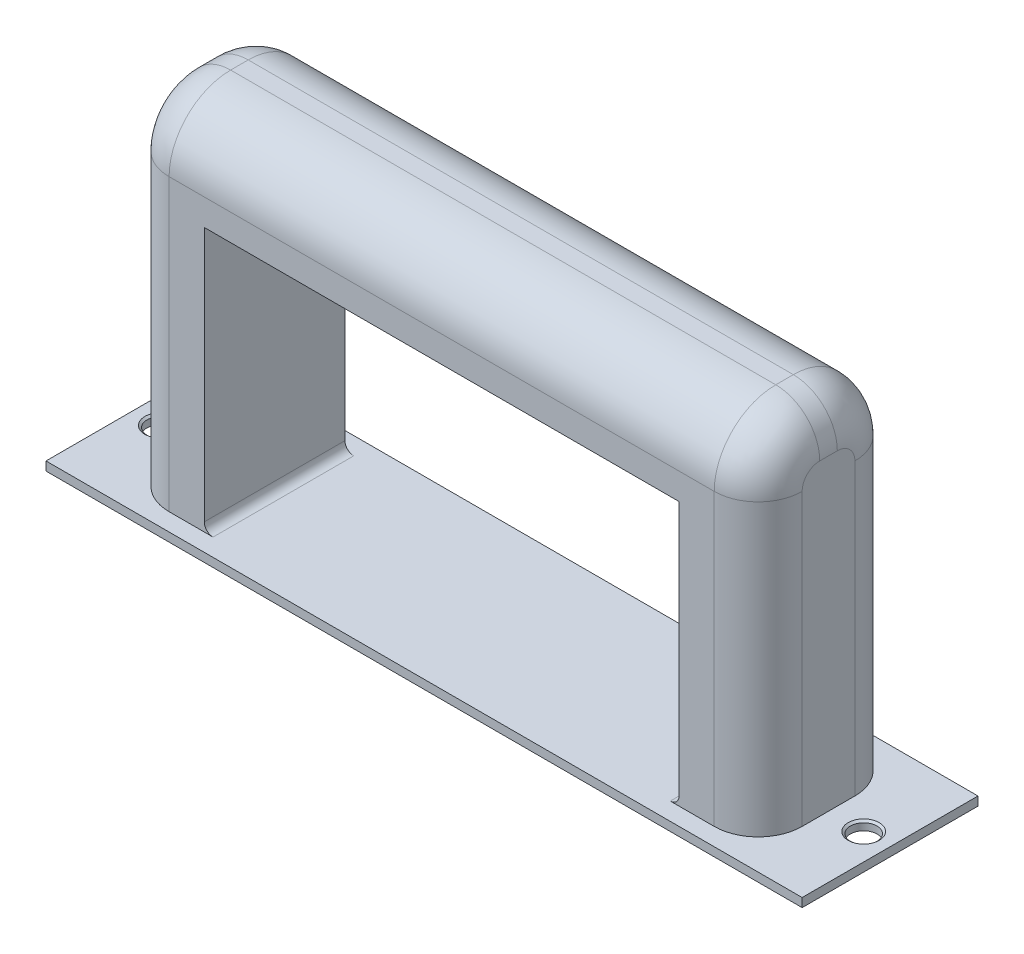
ISO-10303-21;
HEADER;
FILE_DESCRIPTION(('STEP AP214'),'2;1');
FILE_NAME('part.step','',(''),(''),'','','');
FILE_SCHEMA(('AUTOMOTIVE_DESIGN { 1 0 10303 214 1 1 1 1 }'));
ENDSEC;
DATA;
#1=APPLICATION_CONTEXT('core data for automotive mechanical design processes');
#2=APPLICATION_PROTOCOL_DEFINITION('international standard','automotive_design',2000,#1);
#3=PRODUCT_CONTEXT('',#1,'mechanical');
#4=PRODUCT('Part','Part','',(#3));
#5=PRODUCT_RELATED_PRODUCT_CATEGORY('part','',(#4));
#6=PRODUCT_DEFINITION_FORMATION('','',#4);
#7=PRODUCT_DEFINITION_CONTEXT('part definition',#1,'design');
#8=PRODUCT_DEFINITION('design','',#6,#7);
#9=PRODUCT_DEFINITION_SHAPE('','',#8);
#10=(LENGTH_UNIT() NAMED_UNIT(*) SI_UNIT(.MILLI.,.METRE.));
#11=(NAMED_UNIT(*) PLANE_ANGLE_UNIT() SI_UNIT($,.RADIAN.));
#12=(NAMED_UNIT(*) SI_UNIT($,.STERADIAN.) SOLID_ANGLE_UNIT());
#13=UNCERTAINTY_MEASURE_WITH_UNIT(LENGTH_MEASURE(1.E-05),#10,'distance_accuracy_value','');
#14=(GEOMETRIC_REPRESENTATION_CONTEXT(3) GLOBAL_UNCERTAINTY_ASSIGNED_CONTEXT((#13)) GLOBAL_UNIT_ASSIGNED_CONTEXT((#10,
#11,#12)) REPRESENTATION_CONTEXT('',''));
#15=CARTESIAN_POINT('',(0.,0.,0.));
#16=DIRECTION('',(0.,0.,1.));
#17=DIRECTION('',(1.,0.,0.));
#18=AXIS2_PLACEMENT_3D('',#15,#16,#17);
#19=CARTESIAN_POINT('',(0.,2.54,0.));
#20=DIRECTION('',(0.,-1.,0.));
#21=DIRECTION('',(0.,0.,-1.));
#22=AXIS2_PLACEMENT_3D('',#19,#20,#21);
#23=PLANE('',#22);
#24=CARTESIAN_POINT('',(210.82,2.54,-25.4));
#25=DIRECTION('',(0.,1.,0.));
#26=DIRECTION('',(0.,0.,1.));
#27=AXIS2_PLACEMENT_3D('',#24,#25,#26);
#28=CIRCLE('',#27,4.47040000000001);
#29=CARTESIAN_POINT('',(210.82,2.54,-20.9296));
#30=VERTEX_POINT('',#29);
#31=EDGE_CURVE('E734',#30,#30,#28,.T.);
#32=ORIENTED_EDGE('',*,*,#31,.F.);
#33=EDGE_LOOP('',(#32));
#34=FACE_BOUND('',#33,.T.);
#35=DIRECTION('',(-1.,0.,0.));
#36=VECTOR('',#35,1.);
#37=CARTESIAN_POINT('',(0.,2.54,-50.8));
#38=LINE('',#37,#36);
#39=CARTESIAN_POINT('',(218.44,2.54,-50.8));
#40=VERTEX_POINT('',#39);
#41=CARTESIAN_POINT('',(0.,2.54,-50.8));
#42=VERTEX_POINT('',#41);
#43=EDGE_CURVE('E246',#40,#42,#38,.T.);
#44=ORIENTED_EDGE('',*,*,#43,.T.);
#45=DIRECTION('',(0.,0.,1.));
#46=VECTOR('',#45,1.);
#47=CARTESIAN_POINT('',(0.,2.54,0.));
#48=LINE('',#47,#46);
#49=CARTESIAN_POINT('',(0.,2.54,0.));
#50=VERTEX_POINT('',#49);
#51=EDGE_CURVE('E238',#42,#50,#48,.T.);
#52=ORIENTED_EDGE('',*,*,#51,.T.);
#53=DIRECTION('',(1.,0.,0.));
#54=VECTOR('',#53,1.);
#55=CARTESIAN_POINT('',(0.,2.54,0.));
#56=LINE('',#55,#54);
#57=CARTESIAN_POINT('',(218.44,2.54,0.));
#58=VERTEX_POINT('',#57);
#59=EDGE_CURVE('E241',#50,#58,#56,.T.);
#60=ORIENTED_EDGE('',*,*,#59,.T.);
#61=DIRECTION('',(0.,0.,-1.));
#62=VECTOR('',#61,1.);
#63=CARTESIAN_POINT('',(218.44,2.54,0.));
#64=LINE('',#63,#62);
#65=EDGE_CURVE('E244',#58,#40,#64,.T.);
#66=ORIENTED_EDGE('',*,*,#65,.T.);
#67=EDGE_LOOP('',(#44,#52,#60,#66));
#68=FACE_BOUND('',#67,.T.);
#69=DIRECTION('',(-1.,0.,0.));
#70=VECTOR('',#69,1.);
#71=CARTESIAN_POINT('',(17.78,2.54,-45.72));
#72=LINE('',#71,#70);
#73=CARTESIAN_POINT('',(43.18,2.54,-45.72));
#74=VERTEX_POINT('',#73);
#75=CARTESIAN_POINT('',(30.48,2.54,-45.72));
#76=VERTEX_POINT('',#75);
#77=EDGE_CURVE('E235',#74,#76,#72,.T.);
#78=ORIENTED_EDGE('',*,*,#77,.F.);
#79=DIRECTION('',(0.,0.,1.));
#80=VECTOR('',#79,1.);
#81=CARTESIAN_POINT('',(43.18,2.54,0.));
#82=LINE('',#81,#80);
#83=CARTESIAN_POINT('',(43.18,2.54,-5.08));
#84=VERTEX_POINT('',#83);
#85=EDGE_CURVE('E367',#74,#84,#82,.T.);
#86=ORIENTED_EDGE('',*,*,#85,.T.);
#87=DIRECTION('',(1.,0.,0.));
#88=VECTOR('',#87,1.);
#89=CARTESIAN_POINT('',(17.78,2.54,-5.08));
#90=LINE('',#89,#88);
#91=CARTESIAN_POINT('',(30.48,2.54,-5.08));
#92=VERTEX_POINT('',#91);
#93=EDGE_CURVE('E230',#92,#84,#90,.T.);
#94=ORIENTED_EDGE('',*,*,#93,.F.);
#95=CARTESIAN_POINT('',(30.48,2.54,-17.78));
#96=DIRECTION('',(0.,-1.,0.));
#97=DIRECTION('',(0.,0.,-1.));
#98=AXIS2_PLACEMENT_3D('',#95,#96,#97);
#99=CIRCLE('',#98,12.7);
#100=CARTESIAN_POINT('',(17.78,2.54,-17.78));
#101=VERTEX_POINT('',#100);
#102=EDGE_CURVE('E312',#101,#92,#99,.F.);
#103=ORIENTED_EDGE('',*,*,#102,.F.);
#104=DIRECTION('',(0.,0.,1.));
#105=VECTOR('',#104,1.);
#106=CARTESIAN_POINT('',(17.78,2.54,-45.72));
#107=LINE('',#106,#105);
#108=CARTESIAN_POINT('',(17.78,2.54,-33.02));
#109=VERTEX_POINT('',#108);
#110=EDGE_CURVE('E214',#109,#101,#107,.T.);
#111=ORIENTED_EDGE('',*,*,#110,.F.);
#112=CARTESIAN_POINT('',(30.48,2.54,-33.02));
#113=DIRECTION('',(0.,-1.,0.));
#114=DIRECTION('',(0.,0.,-1.));
#115=AXIS2_PLACEMENT_3D('',#112,#113,#114);
#116=CIRCLE('',#115,12.7);
#117=EDGE_CURVE('E324',#76,#109,#116,.F.);
#118=ORIENTED_EDGE('',*,*,#117,.F.);
#119=EDGE_LOOP('',(#78,#86,#94,#103,#111,#118));
#120=FACE_BOUND('',#119,.T.);
#121=DIRECTION('',(0.,0.,1.));
#122=VECTOR('',#121,1.);
#123=CARTESIAN_POINT('',(175.26,2.54,-106.68));
#124=LINE('',#123,#122);
#125=CARTESIAN_POINT('',(175.26,2.54,-5.08));
#126=VERTEX_POINT('',#125);
#127=CARTESIAN_POINT('',(175.26,2.54,-45.72));
#128=VERTEX_POINT('',#127);
#129=EDGE_CURVE('E379',#126,#128,#124,.F.);
#130=ORIENTED_EDGE('',*,*,#129,.T.);
#131=CARTESIAN_POINT('',(187.96,2.54,-45.72));
#132=VERTEX_POINT('',#131);
#133=EDGE_CURVE('E58',#132,#128,#72,.T.);
#134=ORIENTED_EDGE('',*,*,#133,.F.);
#135=CARTESIAN_POINT('',(187.96,2.54,-33.02));
#136=DIRECTION('',(0.,-1.,0.));
#137=DIRECTION('',(0.,0.,-1.));
#138=AXIS2_PLACEMENT_3D('',#135,#136,#137);
#139=CIRCLE('',#138,12.7);
#140=CARTESIAN_POINT('',(200.66,2.54,-33.02));
#141=VERTEX_POINT('',#140);
#142=EDGE_CURVE('E355',#141,#132,#139,.F.);
#143=ORIENTED_EDGE('',*,*,#142,.F.);
#144=DIRECTION('',(0.,0.,-1.));
#145=VECTOR('',#144,1.);
#146=CARTESIAN_POINT('',(200.66,2.54,-45.72));
#147=LINE('',#146,#145);
#148=CARTESIAN_POINT('',(200.66,2.54,-17.78));
#149=VERTEX_POINT('',#148);
#150=EDGE_CURVE('E232',#149,#141,#147,.T.);
#151=ORIENTED_EDGE('',*,*,#150,.F.);
#152=CARTESIAN_POINT('',(187.96,2.54,-17.78));
#153=DIRECTION('',(0.,-1.,0.));
#154=DIRECTION('',(0.,0.,-1.));
#155=AXIS2_PLACEMENT_3D('',#152,#153,#154);
#156=CIRCLE('',#155,12.7);
#157=CARTESIAN_POINT('',(187.96,2.54,-5.08));
#158=VERTEX_POINT('',#157);
#159=EDGE_CURVE('E365',#158,#149,#156,.F.);
#160=ORIENTED_EDGE('',*,*,#159,.F.);
#161=EDGE_CURVE('E66',#126,#158,#90,.T.);
#162=ORIENTED_EDGE('',*,*,#161,.F.);
#163=EDGE_LOOP('',(#130,#134,#143,#151,#160,#162));
#164=FACE_BOUND('',#163,.T.);
#165=CARTESIAN_POINT('',(7.62,2.54,-25.4));
#166=DIRECTION('',(0.,1.,0.));
#167=DIRECTION('',(0.,0.,1.));
#168=AXIS2_PLACEMENT_3D('',#165,#166,#167);
#169=CIRCLE('',#168,4.4704);
#170=CARTESIAN_POINT('',(7.62,2.54,-20.9296));
#171=VERTEX_POINT('',#170);
#172=EDGE_CURVE('E741',#171,#171,#169,.T.);
#173=ORIENTED_EDGE('',*,*,#172,.F.);
#174=EDGE_LOOP('',(#173));
#175=FACE_BOUND('',#174,.T.);
#176=ADVANCED_FACE('F43',(#34,#68,#120,#164,#175),#23,.F.);
#177=CARTESIAN_POINT('',(175.26,5.08,-106.68));
#178=DIRECTION('',(0.,0.,-1.));
#179=DIRECTION('',(-1.,0.,0.));
#180=AXIS2_PLACEMENT_3D('',#177,#178,#179);
#181=CYLINDRICAL_SURFACE('',#180,2.54);
#182=DIRECTION('',(0.,0.,1.));
#183=VECTOR('',#182,1.);
#184=CARTESIAN_POINT('',(177.8,5.08,-106.68));
#185=LINE('',#184,#183);
#186=CARTESIAN_POINT('',(177.8,5.07999999999999,-45.72));
#187=VERTEX_POINT('',#186);
#188=CARTESIAN_POINT('',(177.8,5.08,-5.08));
#189=VERTEX_POINT('',#188);
#190=EDGE_CURVE('E200',#187,#189,#185,.T.);
#191=ORIENTED_EDGE('',*,*,#190,.F.);
#192=CARTESIAN_POINT('',(175.26,5.08,-45.72));
#193=DIRECTION('',(0.,0.,1.));
#194=DIRECTION('',(1.,0.,0.));
#195=AXIS2_PLACEMENT_3D('',#192,#193,#194);
#196=CIRCLE('',#195,2.54);
#197=EDGE_CURVE('E51',#187,#128,#196,.F.);
#198=ORIENTED_EDGE('',*,*,#197,.T.);
#199=ORIENTED_EDGE('',*,*,#129,.F.);
#200=CARTESIAN_POINT('',(175.26,5.08,-5.08));
#201=DIRECTION('',(0.,0.,-1.));
#202=DIRECTION('',(-1.,0.,0.));
#203=AXIS2_PLACEMENT_3D('',#200,#201,#202);
#204=CIRCLE('',#203,2.54);
#205=EDGE_CURVE('E11',#126,#189,#204,.F.);
#206=ORIENTED_EDGE('',*,*,#205,.T.);
#207=EDGE_LOOP('',(#191,#198,#199,#206));
#208=FACE_BOUND('',#207,.T.);
#209=ADVANCED_FACE('F45',(#208),#181,.F.);
#210=CARTESIAN_POINT('',(43.18,5.08,0.));
#211=DIRECTION('',(0.,0.,1.));
#212=DIRECTION('',(1.,0.,0.));
#213=AXIS2_PLACEMENT_3D('',#210,#211,#212);
#214=CYLINDRICAL_SURFACE('',#213,2.54);
#215=ORIENTED_EDGE('',*,*,#85,.F.);
#216=CARTESIAN_POINT('',(43.18,5.08,-45.72));
#217=DIRECTION('',(0.,0.,1.));
#218=DIRECTION('',(1.,0.,0.));
#219=AXIS2_PLACEMENT_3D('',#216,#217,#218);
#220=CIRCLE('',#219,2.54);
#221=CARTESIAN_POINT('',(40.64,5.07999999999999,-45.72));
#222=VERTEX_POINT('',#221);
#223=EDGE_CURVE('E373',#74,#222,#220,.F.);
#224=ORIENTED_EDGE('',*,*,#223,.T.);
#225=DIRECTION('',(0.,0.,1.));
#226=VECTOR('',#225,1.);
#227=CARTESIAN_POINT('',(40.64,5.08,-106.68));
#228=LINE('',#227,#226);
#229=CARTESIAN_POINT('',(40.64,5.08,-5.08));
#230=VERTEX_POINT('',#229);
#231=EDGE_CURVE('E370',#230,#222,#228,.F.);
#232=ORIENTED_EDGE('',*,*,#231,.F.);
#233=CARTESIAN_POINT('',(43.18,5.08,-5.08));
#234=DIRECTION('',(0.,0.,-1.));
#235=DIRECTION('',(-1.,0.,0.));
#236=AXIS2_PLACEMENT_3D('',#233,#234,#235);
#237=CIRCLE('',#236,2.54);
#238=EDGE_CURVE('E375',#230,#84,#237,.F.);
#239=ORIENTED_EDGE('',*,*,#238,.T.);
#240=EDGE_LOOP('',(#215,#224,#232,#239));
#241=FACE_BOUND('',#240,.T.);
#242=ADVANCED_FACE('F417',(#241),#214,.F.);
#243=CARTESIAN_POINT('',(187.96,86.36,-22.86));
#244=DIRECTION('',(-1.,0.,0.));
#245=DIRECTION('',(0.,0.,1.));
#246=AXIS2_PLACEMENT_3D('',#243,#244,#245);
#247=DEGENERATE_TOROIDAL_SURFACE('',#246,5.08,12.7,.T.);
#248=CARTESIAN_POINT('',(187.96,86.36,-17.78));
#249=DIRECTION('',(0.,-1.,0.));
#250=DIRECTION('',(0.,0.,-1.));
#251=AXIS2_PLACEMENT_3D('',#248,#249,#250);
#252=CIRCLE('',#251,12.7);
#253=CARTESIAN_POINT('',(200.66,86.36,-17.78));
#254=VERTEX_POINT('',#253);
#255=CARTESIAN_POINT('',(187.96,86.36,-5.08));
#256=VERTEX_POINT('',#255);
#257=EDGE_CURVE('E363',#254,#256,#252,.T.);
#258=ORIENTED_EDGE('',*,*,#257,.F.);
#259=CARTESIAN_POINT('',(200.66,86.36,-22.86));
#260=DIRECTION('',(-1.,0.,0.));
#261=DIRECTION('',(0.,0.,1.));
#262=AXIS2_PLACEMENT_3D('',#259,#260,#261);
#263=CIRCLE('',#262,5.08);
#264=CARTESIAN_POINT('',(200.66,91.44,-22.86));
#265=VERTEX_POINT('',#264);
#266=EDGE_CURVE('E329',#265,#254,#263,.F.);
#267=ORIENTED_EDGE('',*,*,#266,.F.);
#268=CARTESIAN_POINT('',(187.96,91.44,-22.86));
#269=DIRECTION('',(0.,0.,1.));
#270=DIRECTION('',(1.,0.,0.));
#271=AXIS2_PLACEMENT_3D('',#268,#269,#270);
#272=CIRCLE('',#271,12.7);
#273=CARTESIAN_POINT('',(187.96,104.14,-22.86));
#274=VERTEX_POINT('',#273);
#275=EDGE_CURVE('E361',#265,#274,#272,.T.);
#276=ORIENTED_EDGE('',*,*,#275,.T.);
#277=CARTESIAN_POINT('',(187.96,86.36,-22.86));
#278=DIRECTION('',(-1.,0.,0.));
#279=DIRECTION('',(0.,0.,1.));
#280=AXIS2_PLACEMENT_3D('',#277,#278,#279);
#281=CIRCLE('',#280,17.78);
#282=EDGE_CURVE('E349',#256,#274,#281,.T.);
#283=ORIENTED_EDGE('',*,*,#282,.F.);
#284=EDGE_LOOP('',(#258,#267,#276,#283));
#285=FACE_BOUND('',#284,.T.);
#286=ADVANCED_FACE('F399',(#285),#247,.T.);
#287=CARTESIAN_POINT('',(187.96,91.44,-45.72));
#288=DIRECTION('',(0.,0.,-1.));
#289=DIRECTION('',(-1.,0.,0.));
#290=AXIS2_PLACEMENT_3D('',#287,#288,#289);
#291=CYLINDRICAL_SURFACE('',#290,12.7);
#292=ORIENTED_EDGE('',*,*,#275,.F.);
#293=DIRECTION('',(0.,0.,1.));
#294=VECTOR('',#293,1.);
#295=CARTESIAN_POINT('',(200.66,91.44,-45.72));
#296=LINE('',#295,#294);
#297=CARTESIAN_POINT('',(200.66,91.44,-27.94));
#298=VERTEX_POINT('',#297);
#299=EDGE_CURVE('E332',#298,#265,#296,.T.);
#300=ORIENTED_EDGE('',*,*,#299,.F.);
#301=CARTESIAN_POINT('',(187.96,91.44,-27.94));
#302=DIRECTION('',(0.,0.,1.));
#303=DIRECTION('',(1.,0.,0.));
#304=AXIS2_PLACEMENT_3D('',#301,#302,#303);
#305=CIRCLE('',#304,12.7);
#306=CARTESIAN_POINT('',(187.96,104.14,-27.94));
#307=VERTEX_POINT('',#306);
#308=EDGE_CURVE('E359',#298,#307,#305,.T.);
#309=ORIENTED_EDGE('',*,*,#308,.T.);
#310=DIRECTION('',(0.,0.,1.));
#311=VECTOR('',#310,1.);
#312=CARTESIAN_POINT('',(187.96,104.14,-45.72));
#313=LINE('',#312,#311);
#314=EDGE_CURVE('E346',#274,#307,#313,.F.);
#315=ORIENTED_EDGE('',*,*,#314,.F.);
#316=EDGE_LOOP('',(#292,#300,#309,#315));
#317=FACE_BOUND('',#316,.T.);
#318=ADVANCED_FACE('F439',(#317),#291,.T.);
#319=CARTESIAN_POINT('',(187.96,86.36,-27.94));
#320=DIRECTION('',(-1.,0.,0.));
#321=DIRECTION('',(0.,0.,1.));
#322=AXIS2_PLACEMENT_3D('',#319,#320,#321);
#323=DEGENERATE_TOROIDAL_SURFACE('',#322,5.08,12.7,.T.);
#324=ORIENTED_EDGE('',*,*,#308,.F.);
#325=CARTESIAN_POINT('',(200.66,86.36,-27.94));
#326=DIRECTION('',(-1.,0.,0.));
#327=DIRECTION('',(0.,0.,1.));
#328=AXIS2_PLACEMENT_3D('',#325,#326,#327);
#329=CIRCLE('',#328,5.08);
#330=CARTESIAN_POINT('',(200.66,86.36,-33.02));
#331=VERTEX_POINT('',#330);
#332=EDGE_CURVE('E335',#331,#298,#329,.F.);
#333=ORIENTED_EDGE('',*,*,#332,.F.);
#334=CARTESIAN_POINT('',(187.96,86.36,-33.02));
#335=DIRECTION('',(0.,1.,0.));
#336=DIRECTION('',(0.,0.,1.));
#337=AXIS2_PLACEMENT_3D('',#334,#335,#336);
#338=CIRCLE('',#337,12.7);
#339=CARTESIAN_POINT('',(187.96,86.36,-45.72));
#340=VERTEX_POINT('',#339);
#341=EDGE_CURVE('E357',#331,#340,#338,.T.);
#342=ORIENTED_EDGE('',*,*,#341,.T.);
#343=CARTESIAN_POINT('',(187.96,86.36,-27.94));
#344=DIRECTION('',(-1.,0.,0.));
#345=DIRECTION('',(0.,0.,1.));
#346=AXIS2_PLACEMENT_3D('',#343,#344,#345);
#347=CIRCLE('',#346,17.78);
#348=EDGE_CURVE('E343',#307,#340,#347,.T.);
#349=ORIENTED_EDGE('',*,*,#348,.F.);
#350=EDGE_LOOP('',(#324,#333,#342,#349));
#351=FACE_BOUND('',#350,.T.);
#352=ADVANCED_FACE('F436',(#351),#323,.T.);
#353=CARTESIAN_POINT('',(187.96,104.14,-33.02));
#354=DIRECTION('',(0.,1.,0.));
#355=DIRECTION('',(0.,0.,1.));
#356=AXIS2_PLACEMENT_3D('',#353,#354,#355);
#357=CYLINDRICAL_SURFACE('',#356,12.7);
#358=ORIENTED_EDGE('',*,*,#341,.F.);
#359=DIRECTION('',(0.,1.,0.));
#360=VECTOR('',#359,1.);
#361=CARTESIAN_POINT('',(200.66,104.14,-33.02));
#362=LINE('',#361,#360);
#363=EDGE_CURVE('E338',#141,#331,#362,.T.);
#364=ORIENTED_EDGE('',*,*,#363,.F.);
#365=ORIENTED_EDGE('',*,*,#142,.T.);
#366=DIRECTION('',(0.,1.,0.));
#367=VECTOR('',#366,1.);
#368=CARTESIAN_POINT('',(187.96,104.14,-45.72));
#369=LINE('',#368,#367);
#370=EDGE_CURVE('E341',#340,#132,#369,.F.);
#371=ORIENTED_EDGE('',*,*,#370,.F.);
#372=EDGE_LOOP('',(#358,#364,#365,#371));
#373=FACE_BOUND('',#372,.T.);
#374=ADVANCED_FACE('F387',(#373),#357,.T.);
#375=CARTESIAN_POINT('',(187.96,104.14,-17.78));
#376=DIRECTION('',(0.,-1.,0.));
#377=DIRECTION('',(0.,0.,-1.));
#378=AXIS2_PLACEMENT_3D('',#375,#376,#377);
#379=CYLINDRICAL_SURFACE('',#378,12.7);
#380=DIRECTION('',(0.,-1.,0.));
#381=VECTOR('',#380,1.);
#382=CARTESIAN_POINT('',(200.66,104.14,-17.78));
#383=LINE('',#382,#381);
#384=EDGE_CURVE('E326',#254,#149,#383,.T.);
#385=ORIENTED_EDGE('',*,*,#384,.F.);
#386=ORIENTED_EDGE('',*,*,#257,.T.);
#387=DIRECTION('',(0.,-1.,0.));
#388=VECTOR('',#387,1.);
#389=CARTESIAN_POINT('',(187.96,104.14,-5.08));
#390=LINE('',#389,#388);
#391=EDGE_CURVE('E352',#158,#256,#390,.F.);
#392=ORIENTED_EDGE('',*,*,#391,.F.);
#393=ORIENTED_EDGE('',*,*,#159,.T.);
#394=EDGE_LOOP('',(#385,#386,#392,#393));
#395=FACE_BOUND('',#394,.T.);
#396=ADVANCED_FACE('F394',(#395),#379,.T.);
#397=CARTESIAN_POINT('',(30.48,86.36,-27.94));
#398=DIRECTION('',(1.,0.,0.));
#399=DIRECTION('',(0.,0.,-1.));
#400=AXIS2_PLACEMENT_3D('',#397,#398,#399);
#401=DEGENERATE_TOROIDAL_SURFACE('',#400,5.08,12.7,.T.);
#402=CARTESIAN_POINT('',(30.48,86.36,-33.02));
#403=DIRECTION('',(0.,-1.,0.));
#404=DIRECTION('',(0.,0.,-1.));
#405=AXIS2_PLACEMENT_3D('',#402,#403,#404);
#406=CIRCLE('',#405,12.7);
#407=CARTESIAN_POINT('',(17.78,86.36,-33.02));
#408=VERTEX_POINT('',#407);
#409=CARTESIAN_POINT('',(30.48,86.36,-45.72));
#410=VERTEX_POINT('',#409);
#411=EDGE_CURVE('E322',#408,#410,#406,.T.);
#412=ORIENTED_EDGE('',*,*,#411,.F.);
#413=CARTESIAN_POINT('',(17.78,86.36,-27.94));
#414=DIRECTION('',(1.,0.,0.));
#415=DIRECTION('',(0.,0.,-1.));
#416=AXIS2_PLACEMENT_3D('',#413,#414,#415);
#417=CIRCLE('',#416,5.08);
#418=CARTESIAN_POINT('',(17.78,91.44,-27.94));
#419=VERTEX_POINT('',#418);
#420=EDGE_CURVE('E285',#419,#408,#417,.F.);
#421=ORIENTED_EDGE('',*,*,#420,.F.);
#422=CARTESIAN_POINT('',(30.48,91.44,-27.94));
#423=DIRECTION('',(0.,0.,-1.));
#424=DIRECTION('',(-1.,0.,0.));
#425=AXIS2_PLACEMENT_3D('',#422,#423,#424);
#426=CIRCLE('',#425,12.7);
#427=CARTESIAN_POINT('',(30.48,104.14,-27.94));
#428=VERTEX_POINT('',#427);
#429=EDGE_CURVE('E319',#419,#428,#426,.T.);
#430=ORIENTED_EDGE('',*,*,#429,.T.);
#431=CARTESIAN_POINT('',(30.48,86.36,-27.94));
#432=DIRECTION('',(1.,0.,0.));
#433=DIRECTION('',(0.,0.,-1.));
#434=AXIS2_PLACEMENT_3D('',#431,#432,#433);
#435=CIRCLE('',#434,17.78);
#436=EDGE_CURVE('E306',#410,#428,#435,.T.);
#437=ORIENTED_EDGE('',*,*,#436,.F.);
#438=EDGE_LOOP('',(#412,#421,#430,#437));
#439=FACE_BOUND('',#438,.T.);
#440=ADVANCED_FACE('F428',(#439),#401,.T.);
#441=CARTESIAN_POINT('',(30.48,91.44,-45.72));
#442=DIRECTION('',(0.,0.,1.));
#443=DIRECTION('',(1.,0.,0.));
#444=AXIS2_PLACEMENT_3D('',#441,#442,#443);
#445=CYLINDRICAL_SURFACE('',#444,12.7);
#446=ORIENTED_EDGE('',*,*,#429,.F.);
#447=DIRECTION('',(0.,0.,-1.));
#448=VECTOR('',#447,1.);
#449=CARTESIAN_POINT('',(17.78,91.44,-45.72));
#450=LINE('',#449,#448);
#451=CARTESIAN_POINT('',(17.78,91.44,-22.86));
#452=VERTEX_POINT('',#451);
#453=EDGE_CURVE('E288',#452,#419,#450,.T.);
#454=ORIENTED_EDGE('',*,*,#453,.F.);
#455=CARTESIAN_POINT('',(30.48,91.44,-22.86));
#456=DIRECTION('',(0.,0.,-1.));
#457=DIRECTION('',(-1.,0.,0.));
#458=AXIS2_PLACEMENT_3D('',#455,#456,#457);
#459=CIRCLE('',#458,12.7);
#460=CARTESIAN_POINT('',(30.48,104.14,-22.86));
#461=VERTEX_POINT('',#460);
#462=EDGE_CURVE('E317',#452,#461,#459,.T.);
#463=ORIENTED_EDGE('',*,*,#462,.T.);
#464=DIRECTION('',(0.,0.,-1.));
#465=VECTOR('',#464,1.);
#466=CARTESIAN_POINT('',(30.48,104.14,-45.72));
#467=LINE('',#466,#465);
#468=EDGE_CURVE('E303',#428,#461,#467,.F.);
#469=ORIENTED_EDGE('',*,*,#468,.F.);
#470=EDGE_LOOP('',(#446,#454,#463,#469));
#471=FACE_BOUND('',#470,.T.);
#472=ADVANCED_FACE('F443',(#471),#445,.T.);
#473=CARTESIAN_POINT('',(30.48,86.36,-22.86));
#474=DIRECTION('',(1.,0.,0.));
#475=DIRECTION('',(0.,0.,-1.));
#476=AXIS2_PLACEMENT_3D('',#473,#474,#475);
#477=DEGENERATE_TOROIDAL_SURFACE('',#476,5.08,12.7,.T.);
#478=ORIENTED_EDGE('',*,*,#462,.F.);
#479=CARTESIAN_POINT('',(17.78,86.36,-22.86));
#480=DIRECTION('',(1.,0.,0.));
#481=DIRECTION('',(0.,0.,-1.));
#482=AXIS2_PLACEMENT_3D('',#479,#480,#481);
#483=CIRCLE('',#482,5.08);
#484=CARTESIAN_POINT('',(17.78,86.36,-17.78));
#485=VERTEX_POINT('',#484);
#486=EDGE_CURVE('E291',#485,#452,#483,.F.);
#487=ORIENTED_EDGE('',*,*,#486,.F.);
#488=CARTESIAN_POINT('',(30.48,86.36,-17.78));
#489=DIRECTION('',(0.,1.,0.));
#490=DIRECTION('',(0.,0.,1.));
#491=AXIS2_PLACEMENT_3D('',#488,#489,#490);
#492=CIRCLE('',#491,12.7);
#493=CARTESIAN_POINT('',(30.48,86.36,-5.08));
#494=VERTEX_POINT('',#493);
#495=EDGE_CURVE('E314',#485,#494,#492,.T.);
#496=ORIENTED_EDGE('',*,*,#495,.T.);
#497=CARTESIAN_POINT('',(30.48,86.36,-22.86));
#498=DIRECTION('',(1.,0.,0.));
#499=DIRECTION('',(0.,0.,-1.));
#500=AXIS2_PLACEMENT_3D('',#497,#498,#499);
#501=CIRCLE('',#500,17.78);
#502=EDGE_CURVE('E300',#461,#494,#501,.T.);
#503=ORIENTED_EDGE('',*,*,#502,.F.);
#504=EDGE_LOOP('',(#478,#487,#496,#503));
#505=FACE_BOUND('',#504,.T.);
#506=ADVANCED_FACE('F446',(#505),#477,.T.);
#507=CARTESIAN_POINT('',(30.48,104.14,-17.78));
#508=DIRECTION('',(0.,1.,0.));
#509=DIRECTION('',(0.,0.,1.));
#510=AXIS2_PLACEMENT_3D('',#507,#508,#509);
#511=CYLINDRICAL_SURFACE('',#510,12.7);
#512=ORIENTED_EDGE('',*,*,#495,.F.);
#513=DIRECTION('',(0.,1.,0.));
#514=VECTOR('',#513,1.);
#515=CARTESIAN_POINT('',(17.78,104.14,-17.78));
#516=LINE('',#515,#514);
#517=EDGE_CURVE('E294',#101,#485,#516,.T.);
#518=ORIENTED_EDGE('',*,*,#517,.F.);
#519=ORIENTED_EDGE('',*,*,#102,.T.);
#520=DIRECTION('',(0.,1.,0.));
#521=VECTOR('',#520,1.);
#522=CARTESIAN_POINT('',(30.48,104.14,-5.08));
#523=LINE('',#522,#521);
#524=EDGE_CURVE('E297',#494,#92,#523,.F.);
#525=ORIENTED_EDGE('',*,*,#524,.F.);
#526=EDGE_LOOP('',(#512,#518,#519,#525));
#527=FACE_BOUND('',#526,.T.);
#528=ADVANCED_FACE('F408',(#527),#511,.T.);
#529=CARTESIAN_POINT('',(30.48,104.14,-33.02));
#530=DIRECTION('',(0.,-1.,0.));
#531=DIRECTION('',(0.,0.,-1.));
#532=AXIS2_PLACEMENT_3D('',#529,#530,#531);
#533=CYLINDRICAL_SURFACE('',#532,12.7);
#534=DIRECTION('',(0.,-1.,0.));
#535=VECTOR('',#534,1.);
#536=CARTESIAN_POINT('',(17.78,104.14,-33.02));
#537=LINE('',#536,#535);
#538=EDGE_CURVE('E282',#408,#109,#537,.T.);
#539=ORIENTED_EDGE('',*,*,#538,.F.);
#540=ORIENTED_EDGE('',*,*,#411,.T.);
#541=DIRECTION('',(0.,-1.,0.));
#542=VECTOR('',#541,1.);
#543=CARTESIAN_POINT('',(30.48,104.14,-45.72));
#544=LINE('',#543,#542);
#545=EDGE_CURVE('E309',#76,#410,#544,.F.);
#546=ORIENTED_EDGE('',*,*,#545,.F.);
#547=ORIENTED_EDGE('',*,*,#117,.T.);
#548=EDGE_LOOP('',(#539,#540,#546,#547));
#549=FACE_BOUND('',#548,.T.);
#550=ADVANCED_FACE('F450',(#549),#533,.T.);
#551=CARTESIAN_POINT('',(0.,86.36,-27.94));
#552=DIRECTION('',(1.,0.,0.));
#553=DIRECTION('',(0.,0.,-1.));
#554=AXIS2_PLACEMENT_3D('',#551,#552,#553);
#555=CYLINDRICAL_SURFACE('',#554,17.78);
#556=DIRECTION('',(-1.,0.,0.));
#557=VECTOR('',#556,1.);
#558=CARTESIAN_POINT('',(0.,104.14,-27.94));
#559=LINE('',#558,#557);
#560=EDGE_CURVE('E277',#307,#428,#559,.T.);
#561=ORIENTED_EDGE('',*,*,#560,.F.);
#562=ORIENTED_EDGE('',*,*,#348,.T.);
#563=DIRECTION('',(-1.,0.,0.));
#564=VECTOR('',#563,1.);
#565=CARTESIAN_POINT('',(0.,86.36,-45.72));
#566=LINE('',#565,#564);
#567=EDGE_CURVE('E279',#410,#340,#566,.F.);
#568=ORIENTED_EDGE('',*,*,#567,.F.);
#569=ORIENTED_EDGE('',*,*,#436,.T.);
#570=EDGE_LOOP('',(#561,#562,#568,#569));
#571=FACE_BOUND('',#570,.T.);
#572=ADVANCED_FACE('F433',(#571),#555,.T.);
#573=CARTESIAN_POINT('',(0.,86.36,-22.86));
#574=DIRECTION('',(-1.,0.,0.));
#575=DIRECTION('',(0.,0.,1.));
#576=AXIS2_PLACEMENT_3D('',#573,#574,#575);
#577=CYLINDRICAL_SURFACE('',#576,17.78);
#578=DIRECTION('',(1.,0.,0.));
#579=VECTOR('',#578,1.);
#580=CARTESIAN_POINT('',(0.,86.36,-5.08));
#581=LINE('',#580,#579);
#582=EDGE_CURVE('E275',#256,#494,#581,.F.);
#583=ORIENTED_EDGE('',*,*,#582,.F.);
#584=ORIENTED_EDGE('',*,*,#282,.T.);
#585=DIRECTION('',(1.,0.,0.));
#586=VECTOR('',#585,1.);
#587=CARTESIAN_POINT('',(0.,104.14,-22.86));
#588=LINE('',#587,#586);
#589=EDGE_CURVE('E272',#461,#274,#588,.T.);
#590=ORIENTED_EDGE('',*,*,#589,.F.);
#591=ORIENTED_EDGE('',*,*,#502,.T.);
#592=EDGE_LOOP('',(#583,#584,#590,#591));
#593=FACE_BOUND('',#592,.T.);
#594=ADVANCED_FACE('F403',(#593),#577,.T.);
#595=CARTESIAN_POINT('',(0.,0.,0.));
#596=DIRECTION('',(0.,-1.,0.));
#597=DIRECTION('',(0.,0.,-1.));
#598=AXIS2_PLACEMENT_3D('',#595,#596,#597);
#599=PLANE('',#598);
#600=CARTESIAN_POINT('',(210.82,0.,-25.4));
#601=DIRECTION('',(0.,1.,0.));
#602=DIRECTION('',(0.,0.,1.));
#603=AXIS2_PLACEMENT_3D('',#600,#601,#602);
#604=CIRCLE('',#603,3.83539999999999);
#605=CARTESIAN_POINT('',(210.82,0.,-21.5646));
#606=VERTEX_POINT('',#605);
#607=EDGE_CURVE('E736',#606,#606,#604,.T.);
#608=ORIENTED_EDGE('',*,*,#607,.T.);
#609=EDGE_LOOP('',(#608));
#610=FACE_BOUND('',#609,.T.);
#611=CARTESIAN_POINT('',(7.62,0.,-25.4));
#612=DIRECTION('',(0.,1.,0.));
#613=DIRECTION('',(0.,0.,1.));
#614=AXIS2_PLACEMENT_3D('',#611,#612,#613);
#615=CIRCLE('',#614,3.8354);
#616=CARTESIAN_POINT('',(7.62,0.,-21.5646));
#617=VERTEX_POINT('',#616);
#618=EDGE_CURVE('E219',#617,#617,#615,.T.);
#619=ORIENTED_EDGE('',*,*,#618,.T.);
#620=EDGE_LOOP('',(#619));
#621=FACE_BOUND('',#620,.T.);
#622=DIRECTION('',(0.,0.,1.));
#623=VECTOR('',#622,1.);
#624=CARTESIAN_POINT('',(0.,0.,0.));
#625=LINE('',#624,#623);
#626=CARTESIAN_POINT('',(0.,0.,-50.8));
#627=VERTEX_POINT('',#626);
#628=CARTESIAN_POINT('',(0.,0.,0.));
#629=VERTEX_POINT('',#628);
#630=EDGE_CURVE('E237',#627,#629,#625,.T.);
#631=ORIENTED_EDGE('',*,*,#630,.F.);
#632=DIRECTION('',(-1.,0.,0.));
#633=VECTOR('',#632,1.);
#634=CARTESIAN_POINT('',(0.,0.,-50.8));
#635=LINE('',#634,#633);
#636=CARTESIAN_POINT('',(218.44,0.,-50.8));
#637=VERTEX_POINT('',#636);
#638=EDGE_CURVE('E242',#637,#627,#635,.T.);
#639=ORIENTED_EDGE('',*,*,#638,.F.);
#640=DIRECTION('',(0.,0.,-1.));
#641=VECTOR('',#640,1.);
#642=CARTESIAN_POINT('',(218.44,0.,0.));
#643=LINE('',#642,#641);
#644=CARTESIAN_POINT('',(218.44,0.,0.));
#645=VERTEX_POINT('',#644);
#646=EDGE_CURVE('E253',#645,#637,#643,.T.);
#647=ORIENTED_EDGE('',*,*,#646,.F.);
#648=DIRECTION('',(1.,0.,0.));
#649=VECTOR('',#648,1.);
#650=CARTESIAN_POINT('',(0.,0.,0.));
#651=LINE('',#650,#649);
#652=EDGE_CURVE('E251',#629,#645,#651,.T.);
#653=ORIENTED_EDGE('',*,*,#652,.F.);
#654=EDGE_LOOP('',(#631,#639,#647,#653));
#655=FACE_BOUND('',#654,.T.);
#656=ADVANCED_FACE('F475',(#610,#621,#655),#599,.T.);
#657=CARTESIAN_POINT('',(0.,2.54,0.));
#658=DIRECTION('',(1.,0.,0.));
#659=DIRECTION('',(0.,0.,-1.));
#660=AXIS2_PLACEMENT_3D('',#657,#658,#659);
#661=PLANE('',#660);
#662=ORIENTED_EDGE('',*,*,#630,.T.);
#663=DIRECTION('',(0.,-1.,0.));
#664=VECTOR('',#663,1.);
#665=CARTESIAN_POINT('',(0.,2.54,0.));
#666=LINE('',#665,#664);
#667=EDGE_CURVE('E264',#50,#629,#666,.T.);
#668=ORIENTED_EDGE('',*,*,#667,.F.);
#669=ORIENTED_EDGE('',*,*,#51,.F.);
#670=DIRECTION('',(0.,-1.,0.));
#671=VECTOR('',#670,1.);
#672=CARTESIAN_POINT('',(0.,2.54,-50.8));
#673=LINE('',#672,#671);
#674=EDGE_CURVE('E248',#42,#627,#673,.T.);
#675=ORIENTED_EDGE('',*,*,#674,.T.);
#676=EDGE_LOOP('',(#662,#668,#669,#675));
#677=FACE_BOUND('',#676,.T.);
#678=ADVANCED_FACE('F477',(#677),#661,.F.);
#679=CARTESIAN_POINT('',(0.,2.54,0.));
#680=DIRECTION('',(0.,0.,-1.));
#681=DIRECTION('',(-1.,0.,0.));
#682=AXIS2_PLACEMENT_3D('',#679,#680,#681);
#683=PLANE('',#682);
#684=ORIENTED_EDGE('',*,*,#652,.T.);
#685=DIRECTION('',(0.,-1.,0.));
#686=VECTOR('',#685,1.);
#687=CARTESIAN_POINT('',(218.44,2.54,0.));
#688=LINE('',#687,#686);
#689=EDGE_CURVE('E261',#58,#645,#688,.T.);
#690=ORIENTED_EDGE('',*,*,#689,.F.);
#691=ORIENTED_EDGE('',*,*,#59,.F.);
#692=ORIENTED_EDGE('',*,*,#667,.T.);
#693=EDGE_LOOP('',(#684,#690,#691,#692));
#694=FACE_BOUND('',#693,.T.);
#695=ADVANCED_FACE('F486',(#694),#683,.F.);
#696=CARTESIAN_POINT('',(218.44,2.54,0.));
#697=DIRECTION('',(-1.,0.,0.));
#698=DIRECTION('',(0.,0.,1.));
#699=AXIS2_PLACEMENT_3D('',#696,#697,#698);
#700=PLANE('',#699);
#701=ORIENTED_EDGE('',*,*,#646,.T.);
#702=DIRECTION('',(0.,-1.,0.));
#703=VECTOR('',#702,1.);
#704=CARTESIAN_POINT('',(218.44,2.54,-50.8));
#705=LINE('',#704,#703);
#706=EDGE_CURVE('E258',#40,#637,#705,.T.);
#707=ORIENTED_EDGE('',*,*,#706,.F.);
#708=ORIENTED_EDGE('',*,*,#65,.F.);
#709=ORIENTED_EDGE('',*,*,#689,.T.);
#710=EDGE_LOOP('',(#701,#707,#708,#709));
#711=FACE_BOUND('',#710,.T.);
#712=ADVANCED_FACE('F482',(#711),#700,.F.);
#713=CARTESIAN_POINT('',(0.,2.54,-50.8));
#714=DIRECTION('',(0.,0.,1.));
#715=DIRECTION('',(1.,0.,0.));
#716=AXIS2_PLACEMENT_3D('',#713,#714,#715);
#717=PLANE('',#716);
#718=ORIENTED_EDGE('',*,*,#638,.T.);
#719=ORIENTED_EDGE('',*,*,#674,.F.);
#720=ORIENTED_EDGE('',*,*,#43,.F.);
#721=ORIENTED_EDGE('',*,*,#706,.T.);
#722=EDGE_LOOP('',(#718,#719,#720,#721));
#723=FACE_BOUND('',#722,.T.);
#724=ADVANCED_FACE('F479',(#723),#717,.F.);
#725=CARTESIAN_POINT('',(17.78,104.14,-45.72));
#726=DIRECTION('',(1.,0.,0.));
#727=DIRECTION('',(0.,0.,-1.));
#728=AXIS2_PLACEMENT_3D('',#725,#726,#727);
#729=PLANE('',#728);
#730=ORIENTED_EDGE('',*,*,#110,.T.);
#731=ORIENTED_EDGE('',*,*,#517,.T.);
#732=ORIENTED_EDGE('',*,*,#486,.T.);
#733=ORIENTED_EDGE('',*,*,#453,.T.);
#734=ORIENTED_EDGE('',*,*,#420,.T.);
#735=ORIENTED_EDGE('',*,*,#538,.T.);
#736=EDGE_LOOP('',(#730,#731,#732,#733,#734,#735));
#737=FACE_BOUND('',#736,.T.);
#738=ADVANCED_FACE('F448',(#737),#729,.F.);
#739=CARTESIAN_POINT('',(17.78,104.14,-5.08));
#740=DIRECTION('',(0.,0.,-1.));
#741=DIRECTION('',(-1.,0.,0.));
#742=AXIS2_PLACEMENT_3D('',#739,#740,#741);
#743=PLANE('',#742);
#744=ORIENTED_EDGE('',*,*,#161,.T.);
#745=ORIENTED_EDGE('',*,*,#391,.T.);
#746=ORIENTED_EDGE('',*,*,#582,.T.);
#747=ORIENTED_EDGE('',*,*,#524,.T.);
#748=ORIENTED_EDGE('',*,*,#93,.T.);
#749=ORIENTED_EDGE('',*,*,#238,.F.);
#750=DIRECTION('',(0.,1.,0.));
#751=VECTOR('',#750,1.);
#752=CARTESIAN_POINT('',(40.64,2.54,-5.08));
#753=LINE('',#752,#751);
#754=CARTESIAN_POINT('',(40.64,78.74,-5.08));
#755=VERTEX_POINT('',#754);
#756=EDGE_CURVE('E203',#230,#755,#753,.T.);
#757=ORIENTED_EDGE('',*,*,#756,.T.);
#758=DIRECTION('',(1.,0.,0.));
#759=VECTOR('',#758,1.);
#760=CARTESIAN_POINT('',(40.64,78.74,-5.08));
#761=LINE('',#760,#759);
#762=CARTESIAN_POINT('',(177.8,78.74,-5.08));
#763=VERTEX_POINT('',#762);
#764=EDGE_CURVE('E204',#755,#763,#761,.T.);
#765=ORIENTED_EDGE('',*,*,#764,.T.);
#766=DIRECTION('',(0.,1.,0.));
#767=VECTOR('',#766,1.);
#768=CARTESIAN_POINT('',(177.8,2.54,-5.08));
#769=LINE('',#768,#767);
#770=EDGE_CURVE('E194',#189,#763,#769,.T.);
#771=ORIENTED_EDGE('',*,*,#770,.F.);
#772=ORIENTED_EDGE('',*,*,#205,.F.);
#773=EDGE_LOOP('',(#744,#745,#746,#747,#748,#749,#757,#765,#771,#772));
#774=FACE_BOUND('',#773,.T.);
#775=ADVANCED_FACE('F217',(#774),#743,.F.);
#776=CARTESIAN_POINT('',(200.66,104.14,-45.72));
#777=DIRECTION('',(-1.,0.,0.));
#778=DIRECTION('',(0.,0.,1.));
#779=AXIS2_PLACEMENT_3D('',#776,#777,#778);
#780=PLANE('',#779);
#781=ORIENTED_EDGE('',*,*,#150,.T.);
#782=ORIENTED_EDGE('',*,*,#363,.T.);
#783=ORIENTED_EDGE('',*,*,#332,.T.);
#784=ORIENTED_EDGE('',*,*,#299,.T.);
#785=ORIENTED_EDGE('',*,*,#266,.T.);
#786=ORIENTED_EDGE('',*,*,#384,.T.);
#787=EDGE_LOOP('',(#781,#782,#783,#784,#785,#786));
#788=FACE_BOUND('',#787,.T.);
#789=ADVANCED_FACE('F390',(#788),#780,.F.);
#790=CARTESIAN_POINT('',(17.78,104.14,-45.72));
#791=DIRECTION('',(0.,0.,1.));
#792=DIRECTION('',(1.,0.,0.));
#793=AXIS2_PLACEMENT_3D('',#790,#791,#792);
#794=PLANE('',#793);
#795=ORIENTED_EDGE('',*,*,#567,.T.);
#796=ORIENTED_EDGE('',*,*,#370,.T.);
#797=ORIENTED_EDGE('',*,*,#133,.T.);
#798=ORIENTED_EDGE('',*,*,#197,.F.);
#799=DIRECTION('',(0.,1.,0.));
#800=VECTOR('',#799,1.);
#801=CARTESIAN_POINT('',(177.8,104.14,-45.72));
#802=LINE('',#801,#800);
#803=CARTESIAN_POINT('',(177.8,78.74,-45.72));
#804=VERTEX_POINT('',#803);
#805=EDGE_CURVE('E270',#187,#804,#802,.T.);
#806=ORIENTED_EDGE('',*,*,#805,.T.);
#807=DIRECTION('',(1.,0.,0.));
#808=VECTOR('',#807,1.);
#809=CARTESIAN_POINT('',(17.78,78.74,-45.72));
#810=LINE('',#809,#808);
#811=CARTESIAN_POINT('',(40.64,78.74,-45.72));
#812=VERTEX_POINT('',#811);
#813=EDGE_CURVE('E213',#812,#804,#810,.T.);
#814=ORIENTED_EDGE('',*,*,#813,.F.);
#815=DIRECTION('',(0.,1.,0.));
#816=VECTOR('',#815,1.);
#817=CARTESIAN_POINT('',(40.64,104.14,-45.72));
#818=LINE('',#817,#816);
#819=EDGE_CURVE('E267',#222,#812,#818,.T.);
#820=ORIENTED_EDGE('',*,*,#819,.F.);
#821=ORIENTED_EDGE('',*,*,#223,.F.);
#822=ORIENTED_EDGE('',*,*,#77,.T.);
#823=ORIENTED_EDGE('',*,*,#545,.T.);
#824=EDGE_LOOP('',(#795,#796,#797,#798,#806,#814,#820,#821,#822,#823));
#825=FACE_BOUND('',#824,.T.);
#826=ADVANCED_FACE('F422',(#825),#794,.F.);
#827=CARTESIAN_POINT('',(0.,104.14,0.));
#828=DIRECTION('',(0.,1.,0.));
#829=DIRECTION('',(0.,0.,1.));
#830=AXIS2_PLACEMENT_3D('',#827,#828,#829);
#831=PLANE('',#830);
#832=ORIENTED_EDGE('',*,*,#589,.T.);
#833=ORIENTED_EDGE('',*,*,#314,.T.);
#834=ORIENTED_EDGE('',*,*,#560,.T.);
#835=ORIENTED_EDGE('',*,*,#468,.T.);
#836=EDGE_LOOP('',(#832,#833,#834,#835));
#837=FACE_BOUND('',#836,.T.);
#838=ADVANCED_FACE('F441',(#837),#831,.T.);
#839=CARTESIAN_POINT('',(40.64,78.74,-106.68));
#840=DIRECTION('',(0.,-1.,0.));
#841=DIRECTION('',(0.,0.,-1.));
#842=AXIS2_PLACEMENT_3D('',#839,#840,#841);
#843=PLANE('',#842);
#844=ORIENTED_EDGE('',*,*,#813,.T.);
#845=DIRECTION('',(0.,0.,1.));
#846=VECTOR('',#845,1.);
#847=CARTESIAN_POINT('',(177.8,78.74,-106.68));
#848=LINE('',#847,#846);
#849=EDGE_CURVE('E198',#804,#763,#848,.T.);
#850=ORIENTED_EDGE('',*,*,#849,.T.);
#851=ORIENTED_EDGE('',*,*,#764,.F.);
#852=DIRECTION('',(0.,0.,1.));
#853=VECTOR('',#852,1.);
#854=CARTESIAN_POINT('',(40.64,78.74,-106.68));
#855=LINE('',#854,#853);
#856=EDGE_CURVE('E215',#812,#755,#855,.T.);
#857=ORIENTED_EDGE('',*,*,#856,.F.);
#858=EDGE_LOOP('',(#844,#850,#851,#857));
#859=FACE_BOUND('',#858,.T.);
#860=ADVANCED_FACE('F209',(#859),#843,.T.);
#861=CARTESIAN_POINT('',(177.8,2.54,-106.68));
#862=DIRECTION('',(1.,0.,0.));
#863=DIRECTION('',(0.,0.,-1.));
#864=AXIS2_PLACEMENT_3D('',#861,#862,#863);
#865=PLANE('',#864);
#866=ORIENTED_EDGE('',*,*,#805,.F.);
#867=ORIENTED_EDGE('',*,*,#190,.T.);
#868=ORIENTED_EDGE('',*,*,#770,.T.);
#869=ORIENTED_EDGE('',*,*,#849,.F.);
#870=EDGE_LOOP('',(#866,#867,#868,#869));
#871=FACE_BOUND('',#870,.T.);
#872=ADVANCED_FACE('F197',(#871),#865,.F.);
#873=CARTESIAN_POINT('',(40.64,2.54,-106.68));
#874=DIRECTION('',(1.,0.,0.));
#875=DIRECTION('',(0.,0.,-1.));
#876=AXIS2_PLACEMENT_3D('',#873,#874,#875);
#877=PLANE('',#876);
#878=ORIENTED_EDGE('',*,*,#756,.F.);
#879=ORIENTED_EDGE('',*,*,#231,.T.);
#880=ORIENTED_EDGE('',*,*,#819,.T.);
#881=ORIENTED_EDGE('',*,*,#856,.T.);
#882=EDGE_LOOP('',(#878,#879,#880,#881));
#883=FACE_BOUND('',#882,.T.);
#884=ADVANCED_FACE('F421',(#883),#877,.T.);
#885=CARTESIAN_POINT('',(7.62,2.54,-25.4));
#886=DIRECTION('',(0.,1.,0.));
#887=DIRECTION('',(0.,0.,1.));
#888=AXIS2_PLACEMENT_3D('',#885,#886,#887);
#889=CYLINDRICAL_SURFACE('',#888,3.8354);
#890=ORIENTED_EDGE('',*,*,#618,.F.);
#891=EDGE_LOOP('',(#890));
#892=FACE_BOUND('',#891,.T.);
#893=CARTESIAN_POINT('',(7.62,2.00717173420243,-25.4));
#894=DIRECTION('',(0.,1.,0.));
#895=DIRECTION('',(0.,0.,1.));
#896=AXIS2_PLACEMENT_3D('',#893,#894,#895);
#897=CIRCLE('',#896,3.8354);
#898=CARTESIAN_POINT('',(7.62,2.00717173420243,-21.5646));
#899=VERTEX_POINT('',#898);
#900=EDGE_CURVE('E222',#899,#899,#897,.T.);
#901=ORIENTED_EDGE('',*,*,#900,.T.);
#902=EDGE_LOOP('',(#901));
#903=FACE_BOUND('',#902,.T.);
#904=ADVANCED_FACE('F558',(#892,#903),#889,.F.);
#905=CARTESIAN_POINT('',(7.62,2.54,-25.4));
#906=DIRECTION('',(0.,1.,0.));
#907=DIRECTION('',(0.,0.,1.));
#908=AXIS2_PLACEMENT_3D('',#905,#906,#907);
#909=CONICAL_SURFACE('',#908,4.4704,0.872664625997165);
#910=ORIENTED_EDGE('',*,*,#900,.F.);
#911=EDGE_LOOP('',(#910));
#912=FACE_BOUND('',#911,.T.);
#913=ORIENTED_EDGE('',*,*,#172,.T.);
#914=EDGE_LOOP('',(#913));
#915=FACE_BOUND('',#914,.T.);
#916=ADVANCED_FACE('F563',(#912,#915),#909,.F.);
#917=CARTESIAN_POINT('',(210.82,2.54,-25.4));
#918=DIRECTION('',(0.,1.,0.));
#919=DIRECTION('',(0.,0.,1.));
#920=AXIS2_PLACEMENT_3D('',#917,#918,#919);
#921=CYLINDRICAL_SURFACE('',#920,3.83539999999999);
#922=ORIENTED_EDGE('',*,*,#607,.F.);
#923=EDGE_LOOP('',(#922));
#924=FACE_BOUND('',#923,.T.);
#925=CARTESIAN_POINT('',(210.82,2.00717173420243,-25.4));
#926=DIRECTION('',(0.,1.,0.));
#927=DIRECTION('',(0.,0.,1.));
#928=AXIS2_PLACEMENT_3D('',#925,#926,#927);
#929=CIRCLE('',#928,3.83539999999999);
#930=CARTESIAN_POINT('',(210.82,2.00717173420243,-21.5646));
#931=VERTEX_POINT('',#930);
#932=EDGE_CURVE('E732',#931,#931,#929,.T.);
#933=ORIENTED_EDGE('',*,*,#932,.T.);
#934=EDGE_LOOP('',(#933));
#935=FACE_BOUND('',#934,.T.);
#936=ADVANCED_FACE('F573',(#924,#935),#921,.F.);
#937=CARTESIAN_POINT('',(210.82,2.54,-25.4));
#938=DIRECTION('',(0.,1.,0.));
#939=DIRECTION('',(0.,0.,1.));
#940=AXIS2_PLACEMENT_3D('',#937,#938,#939);
#941=CONICAL_SURFACE('',#940,4.47040000000001,0.872664625997181);
#942=ORIENTED_EDGE('',*,*,#932,.F.);
#943=EDGE_LOOP('',(#942));
#944=FACE_BOUND('',#943,.T.);
#945=ORIENTED_EDGE('',*,*,#31,.T.);
#946=EDGE_LOOP('',(#945));
#947=FACE_BOUND('',#946,.T.);
#948=ADVANCED_FACE('F583',(#944,#947),#941,.F.);
#949=CLOSED_SHELL('',(#176,#209,#242,#286,#318,#352,#374,#396,#440,#472,#506,#528,#550,#572,
#594,#656,#678,#695,#712,#724,#738,#775,#789,#826,#838,#860,#872,#884,#904,#916,#936,#948));
#950=MANIFOLD_SOLID_BREP('B2',#949);
#951=ADVANCED_BREP_SHAPE_REPRESENTATION('',(#18,#950),#14);
#952=SHAPE_DEFINITION_REPRESENTATION(#9,#951);
ENDSEC;
END-ISO-10303-21;
